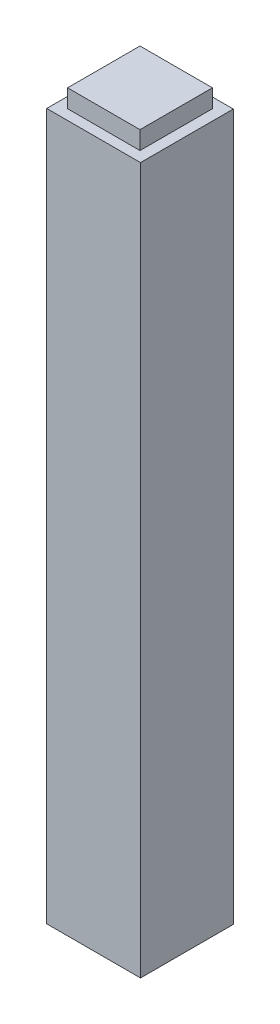
ISO-10303-21;
HEADER;
FILE_DESCRIPTION(('STEP AP214'),'2;1');
FILE_NAME('part.step','',(''),(''),'','','');
FILE_SCHEMA(('AUTOMOTIVE_DESIGN { 1 0 10303 214 1 1 1 1 }'));
ENDSEC;
DATA;
#1=APPLICATION_CONTEXT('core data for automotive mechanical design processes');
#2=APPLICATION_PROTOCOL_DEFINITION('international standard','automotive_design',2000,#1);
#3=PRODUCT_CONTEXT('',#1,'mechanical');
#4=PRODUCT('Part','Part','',(#3));
#5=PRODUCT_RELATED_PRODUCT_CATEGORY('part','',(#4));
#6=PRODUCT_DEFINITION_FORMATION('','',#4);
#7=PRODUCT_DEFINITION_CONTEXT('part definition',#1,'design');
#8=PRODUCT_DEFINITION('design','',#6,#7);
#9=PRODUCT_DEFINITION_SHAPE('','',#8);
#10=(LENGTH_UNIT() NAMED_UNIT(*) SI_UNIT(.MILLI.,.METRE.));
#11=(NAMED_UNIT(*) PLANE_ANGLE_UNIT() SI_UNIT($,.RADIAN.));
#12=(NAMED_UNIT(*) SI_UNIT($,.STERADIAN.) SOLID_ANGLE_UNIT());
#13=UNCERTAINTY_MEASURE_WITH_UNIT(LENGTH_MEASURE(1.E-05),#10,'distance_accuracy_value','');
#14=(GEOMETRIC_REPRESENTATION_CONTEXT(3) GLOBAL_UNCERTAINTY_ASSIGNED_CONTEXT((#13)) GLOBAL_UNIT_ASSIGNED_CONTEXT((#10,
#11,#12)) REPRESENTATION_CONTEXT('',''));
#15=CARTESIAN_POINT('',(0.,0.,0.));
#16=DIRECTION('',(0.,0.,1.));
#17=DIRECTION('',(1.,0.,0.));
#18=AXIS2_PLACEMENT_3D('',#15,#16,#17);
#19=CARTESIAN_POINT('',(-25.8990840738988,390.,25.6196070532155));
#20=DIRECTION('',(-1.,0.,0.));
#21=DIRECTION('',(0.,0.,1.));
#22=AXIS2_PLACEMENT_3D('',#19,#20,#21);
#23=PLANE('',#22);
#24=DIRECTION('',(0.,0.,-1.));
#25=VECTOR('',#24,1.);
#26=CARTESIAN_POINT('',(-25.8990840738988,0.,25.6196070532155));
#27=LINE('',#26,#25);
#28=CARTESIAN_POINT('',(-25.8990840738988,0.,25.6196070532155));
#29=VERTEX_POINT('',#28);
#30=CARTESIAN_POINT('',(-25.8990840738988,0.,-25.6196070532155));
#31=VERTEX_POINT('',#30);
#32=EDGE_CURVE('E117',#29,#31,#27,.T.);
#33=ORIENTED_EDGE('',*,*,#32,.F.);
#34=DIRECTION('',(0.,-1.,0.));
#35=VECTOR('',#34,1.);
#36=CARTESIAN_POINT('',(-25.8990840738988,390.,25.6196070532155));
#37=LINE('',#36,#35);
#38=CARTESIAN_POINT('',(-25.8990840738988,390.,25.6196070532155));
#39=VERTEX_POINT('',#38);
#40=EDGE_CURVE('E12',#39,#29,#37,.T.);
#41=ORIENTED_EDGE('',*,*,#40,.F.);
#42=DIRECTION('',(0.,0.,-1.));
#43=VECTOR('',#42,1.);
#44=CARTESIAN_POINT('',(-25.8990840738988,390.,25.6196070532155));
#45=LINE('',#44,#43);
#46=CARTESIAN_POINT('',(-25.8990840738988,390.,-25.6196070532155));
#47=VERTEX_POINT('',#46);
#48=EDGE_CURVE('E111',#39,#47,#45,.T.);
#49=ORIENTED_EDGE('',*,*,#48,.T.);
#50=DIRECTION('',(0.,-1.,0.));
#51=VECTOR('',#50,1.);
#52=CARTESIAN_POINT('',(-25.8990840738988,390.,-25.6196070532155));
#53=LINE('',#52,#51);
#54=EDGE_CURVE('E56',#47,#31,#53,.T.);
#55=ORIENTED_EDGE('',*,*,#54,.T.);
#56=EDGE_LOOP('',(#33,#41,#49,#55));
#57=FACE_BOUND('',#56,.T.);
#58=ADVANCED_FACE('F53',(#57),#23,.T.);
#59=CARTESIAN_POINT('',(25.8990840738988,390.,25.6196070532155));
#60=DIRECTION('',(0.,0.,1.));
#61=DIRECTION('',(1.,0.,0.));
#62=AXIS2_PLACEMENT_3D('',#59,#60,#61);
#63=PLANE('',#62);
#64=DIRECTION('',(-1.,0.,0.));
#65=VECTOR('',#64,1.);
#66=CARTESIAN_POINT('',(25.8990840738988,0.,25.6196070532155));
#67=LINE('',#66,#65);
#68=CARTESIAN_POINT('',(25.8990840738988,0.,25.6196070532155));
#69=VERTEX_POINT('',#68);
#70=EDGE_CURVE('E113',#69,#29,#67,.T.);
#71=ORIENTED_EDGE('',*,*,#70,.F.);
#72=DIRECTION('',(0.,-1.,0.));
#73=VECTOR('',#72,1.);
#74=CARTESIAN_POINT('',(25.8990840738988,390.,25.6196070532155));
#75=LINE('',#74,#73);
#76=CARTESIAN_POINT('',(25.8990840738988,390.,25.6196070532155));
#77=VERTEX_POINT('',#76);
#78=EDGE_CURVE('E62',#77,#69,#75,.T.);
#79=ORIENTED_EDGE('',*,*,#78,.F.);
#80=DIRECTION('',(-1.,0.,0.));
#81=VECTOR('',#80,1.);
#82=CARTESIAN_POINT('',(25.8990840738988,390.,25.6196070532155));
#83=LINE('',#82,#81);
#84=EDGE_CURVE('E108',#77,#39,#83,.T.);
#85=ORIENTED_EDGE('',*,*,#84,.T.);
#86=ORIENTED_EDGE('',*,*,#40,.T.);
#87=EDGE_LOOP('',(#71,#79,#85,#86));
#88=FACE_BOUND('',#87,.T.);
#89=ADVANCED_FACE('F127',(#88),#63,.T.);
#90=CARTESIAN_POINT('',(25.8990840738988,390.,25.6196070532155));
#91=DIRECTION('',(1.,0.,0.));
#92=DIRECTION('',(0.,0.,-1.));
#93=AXIS2_PLACEMENT_3D('',#90,#91,#92);
#94=PLANE('',#93);
#95=DIRECTION('',(0.,0.,1.));
#96=VECTOR('',#95,1.);
#97=CARTESIAN_POINT('',(25.8990840738988,0.,25.6196070532155));
#98=LINE('',#97,#96);
#99=CARTESIAN_POINT('',(25.8990840738988,0.,-25.6196070532155));
#100=VERTEX_POINT('',#99);
#101=EDGE_CURVE('E103',#100,#69,#98,.T.);
#102=ORIENTED_EDGE('',*,*,#101,.F.);
#103=DIRECTION('',(0.,-1.,0.));
#104=VECTOR('',#103,1.);
#105=CARTESIAN_POINT('',(25.8990840738988,390.,-25.6196070532155));
#106=LINE('',#105,#104);
#107=CARTESIAN_POINT('',(25.8990840738988,390.,-25.6196070532155));
#108=VERTEX_POINT('',#107);
#109=EDGE_CURVE('E98',#108,#100,#106,.T.);
#110=ORIENTED_EDGE('',*,*,#109,.F.);
#111=DIRECTION('',(0.,0.,1.));
#112=VECTOR('',#111,1.);
#113=CARTESIAN_POINT('',(25.8990840738988,390.,25.6196070532155));
#114=LINE('',#113,#112);
#115=EDGE_CURVE('E101',#108,#77,#114,.T.);
#116=ORIENTED_EDGE('',*,*,#115,.T.);
#117=ORIENTED_EDGE('',*,*,#78,.T.);
#118=EDGE_LOOP('',(#102,#110,#116,#117));
#119=FACE_BOUND('',#118,.T.);
#120=ADVANCED_FACE('F100',(#119),#94,.T.);
#121=CARTESIAN_POINT('',(25.8990840738988,390.,-25.6196070532155));
#122=DIRECTION('',(0.,0.,-1.));
#123=DIRECTION('',(-1.,0.,0.));
#124=AXIS2_PLACEMENT_3D('',#121,#122,#123);
#125=PLANE('',#124);
#126=DIRECTION('',(1.,0.,0.));
#127=VECTOR('',#126,1.);
#128=CARTESIAN_POINT('',(25.8990840738988,0.,-25.6196070532155));
#129=LINE('',#128,#127);
#130=EDGE_CURVE('E120',#31,#100,#129,.T.);
#131=ORIENTED_EDGE('',*,*,#130,.F.);
#132=ORIENTED_EDGE('',*,*,#54,.F.);
#133=DIRECTION('',(1.,0.,0.));
#134=VECTOR('',#133,1.);
#135=CARTESIAN_POINT('',(25.8990840738988,390.,-25.6196070532155));
#136=LINE('',#135,#134);
#137=EDGE_CURVE('E107',#47,#108,#136,.T.);
#138=ORIENTED_EDGE('',*,*,#137,.T.);
#139=ORIENTED_EDGE('',*,*,#109,.T.);
#140=EDGE_LOOP('',(#131,#132,#138,#139));
#141=FACE_BOUND('',#140,.T.);
#142=ADVANCED_FACE('F110',(#141),#125,.T.);
#143=CARTESIAN_POINT('',(0.,390.,0.));
#144=DIRECTION('',(0.,1.,0.));
#145=DIRECTION('',(0.,0.,1.));
#146=AXIS2_PLACEMENT_3D('',#143,#144,#145);
#147=PLANE('',#146);
#148=ORIENTED_EDGE('',*,*,#48,.F.);
#149=ORIENTED_EDGE('',*,*,#84,.F.);
#150=ORIENTED_EDGE('',*,*,#115,.F.);
#151=ORIENTED_EDGE('',*,*,#137,.F.);
#152=EDGE_LOOP('',(#148,#149,#150,#151));
#153=FACE_BOUND('',#152,.T.);
#154=ADVANCED_FACE('F106',(#153),#147,.T.);
#155=CARTESIAN_POINT('',(0.,0.,0.));
#156=DIRECTION('',(0.,1.,0.));
#157=DIRECTION('',(0.,0.,1.));
#158=AXIS2_PLACEMENT_3D('',#155,#156,#157);
#159=PLANE('',#158);
#160=ORIENTED_EDGE('',*,*,#32,.T.);
#161=ORIENTED_EDGE('',*,*,#130,.T.);
#162=ORIENTED_EDGE('',*,*,#101,.T.);
#163=ORIENTED_EDGE('',*,*,#70,.T.);
#164=EDGE_LOOP('',(#160,#161,#162,#163));
#165=FACE_BOUND('',#164,.T.);
#166=ADVANCED_FACE('F126',(#165),#159,.F.);
#167=CLOSED_SHELL('',(#58,#89,#120,#142,#154,#166));
#168=MANIFOLD_SOLID_BREP('B2',#167);
#169=CARTESIAN_POINT('',(20.,400.,20.));
#170=DIRECTION('',(-1.,0.,0.));
#171=DIRECTION('',(0.,0.,1.));
#172=AXIS2_PLACEMENT_3D('',#169,#170,#171);
#173=PLANE('',#172);
#174=DIRECTION('',(0.,0.,-1.));
#175=VECTOR('',#174,1.);
#176=CARTESIAN_POINT('',(20.,0.,20.));
#177=LINE('',#176,#175);
#178=CARTESIAN_POINT('',(20.,0.,20.));
#179=VERTEX_POINT('',#178);
#180=CARTESIAN_POINT('',(20.,0.,-20.));
#181=VERTEX_POINT('',#180);
#182=EDGE_CURVE('E240',#179,#181,#177,.T.);
#183=ORIENTED_EDGE('',*,*,#182,.T.);
#184=DIRECTION('',(0.,-1.,0.));
#185=VECTOR('',#184,1.);
#186=CARTESIAN_POINT('',(20.,400.,-20.));
#187=LINE('',#186,#185);
#188=CARTESIAN_POINT('',(20.,400.,-20.));
#189=VERTEX_POINT('',#188);
#190=EDGE_CURVE('E51',#189,#181,#187,.T.);
#191=ORIENTED_EDGE('',*,*,#190,.F.);
#192=DIRECTION('',(0.,0.,-1.));
#193=VECTOR('',#192,1.);
#194=CARTESIAN_POINT('',(20.,400.,20.));
#195=LINE('',#194,#193);
#196=CARTESIAN_POINT('',(20.,400.,20.));
#197=VERTEX_POINT('',#196);
#198=EDGE_CURVE('E228',#197,#189,#195,.T.);
#199=ORIENTED_EDGE('',*,*,#198,.F.);
#200=DIRECTION('',(0.,-1.,0.));
#201=VECTOR('',#200,1.);
#202=CARTESIAN_POINT('',(20.,400.,20.));
#203=LINE('',#202,#201);
#204=EDGE_CURVE('E236',#197,#179,#203,.T.);
#205=ORIENTED_EDGE('',*,*,#204,.T.);
#206=EDGE_LOOP('',(#183,#191,#199,#205));
#207=FACE_BOUND('',#206,.T.);
#208=ADVANCED_FACE('F177',(#207),#173,.F.);
#209=CARTESIAN_POINT('',(-20.,400.,-20.));
#210=DIRECTION('',(0.,0.,1.));
#211=DIRECTION('',(1.,0.,0.));
#212=AXIS2_PLACEMENT_3D('',#209,#210,#211);
#213=PLANE('',#212);
#214=DIRECTION('',(-1.,0.,0.));
#215=VECTOR('',#214,1.);
#216=CARTESIAN_POINT('',(-20.,0.,-20.));
#217=LINE('',#216,#215);
#218=CARTESIAN_POINT('',(-20.,0.,-20.));
#219=VERTEX_POINT('',#218);
#220=EDGE_CURVE('E232',#181,#219,#217,.T.);
#221=ORIENTED_EDGE('',*,*,#220,.T.);
#222=DIRECTION('',(0.,-1.,0.));
#223=VECTOR('',#222,1.);
#224=CARTESIAN_POINT('',(-20.,400.,-20.));
#225=LINE('',#224,#223);
#226=CARTESIAN_POINT('',(-20.,400.,-20.));
#227=VERTEX_POINT('',#226);
#228=EDGE_CURVE('E185',#227,#219,#225,.T.);
#229=ORIENTED_EDGE('',*,*,#228,.F.);
#230=DIRECTION('',(-1.,0.,0.));
#231=VECTOR('',#230,1.);
#232=CARTESIAN_POINT('',(-20.,400.,-20.));
#233=LINE('',#232,#231);
#234=EDGE_CURVE('E223',#189,#227,#233,.T.);
#235=ORIENTED_EDGE('',*,*,#234,.F.);
#236=ORIENTED_EDGE('',*,*,#190,.T.);
#237=EDGE_LOOP('',(#221,#229,#235,#236));
#238=FACE_BOUND('',#237,.T.);
#239=ADVANCED_FACE('F231',(#238),#213,.F.);
#240=CARTESIAN_POINT('',(-20.,400.,20.));
#241=DIRECTION('',(1.,0.,0.));
#242=DIRECTION('',(0.,0.,-1.));
#243=AXIS2_PLACEMENT_3D('',#240,#241,#242);
#244=PLANE('',#243);
#245=DIRECTION('',(0.,0.,1.));
#246=VECTOR('',#245,1.);
#247=CARTESIAN_POINT('',(-20.,0.,20.));
#248=LINE('',#247,#246);
#249=CARTESIAN_POINT('',(-20.,0.,20.));
#250=VERTEX_POINT('',#249);
#251=EDGE_CURVE('E210',#219,#250,#248,.T.);
#252=ORIENTED_EDGE('',*,*,#251,.T.);
#253=DIRECTION('',(0.,-1.,0.));
#254=VECTOR('',#253,1.);
#255=CARTESIAN_POINT('',(-20.,400.,20.));
#256=LINE('',#255,#254);
#257=CARTESIAN_POINT('',(-20.,400.,20.));
#258=VERTEX_POINT('',#257);
#259=EDGE_CURVE('E233',#258,#250,#256,.T.);
#260=ORIENTED_EDGE('',*,*,#259,.F.);
#261=DIRECTION('',(0.,0.,1.));
#262=VECTOR('',#261,1.);
#263=CARTESIAN_POINT('',(-20.,400.,20.));
#264=LINE('',#263,#262);
#265=EDGE_CURVE('E226',#227,#258,#264,.T.);
#266=ORIENTED_EDGE('',*,*,#265,.F.);
#267=ORIENTED_EDGE('',*,*,#228,.T.);
#268=EDGE_LOOP('',(#252,#260,#266,#267));
#269=FACE_BOUND('',#268,.T.);
#270=ADVANCED_FACE('F234',(#269),#244,.F.);
#271=CARTESIAN_POINT('',(-20.,400.,20.));
#272=DIRECTION('',(0.,0.,-1.));
#273=DIRECTION('',(-1.,0.,0.));
#274=AXIS2_PLACEMENT_3D('',#271,#272,#273);
#275=PLANE('',#274);
#276=DIRECTION('',(1.,0.,0.));
#277=VECTOR('',#276,1.);
#278=CARTESIAN_POINT('',(-20.,0.,20.));
#279=LINE('',#278,#277);
#280=EDGE_CURVE('E216',#250,#179,#279,.T.);
#281=ORIENTED_EDGE('',*,*,#280,.T.);
#282=ORIENTED_EDGE('',*,*,#204,.F.);
#283=DIRECTION('',(1.,0.,0.));
#284=VECTOR('',#283,1.);
#285=CARTESIAN_POINT('',(-20.,400.,20.));
#286=LINE('',#285,#284);
#287=EDGE_CURVE('E193',#258,#197,#286,.T.);
#288=ORIENTED_EDGE('',*,*,#287,.F.);
#289=ORIENTED_EDGE('',*,*,#259,.T.);
#290=EDGE_LOOP('',(#281,#282,#288,#289));
#291=FACE_BOUND('',#290,.T.);
#292=ADVANCED_FACE('F247',(#291),#275,.F.);
#293=CARTESIAN_POINT('',(0.,400.,0.));
#294=DIRECTION('',(0.,-1.,0.));
#295=DIRECTION('',(0.,0.,-1.));
#296=AXIS2_PLACEMENT_3D('',#293,#294,#295);
#297=PLANE('',#296);
#298=ORIENTED_EDGE('',*,*,#198,.T.);
#299=ORIENTED_EDGE('',*,*,#234,.T.);
#300=ORIENTED_EDGE('',*,*,#265,.T.);
#301=ORIENTED_EDGE('',*,*,#287,.T.);
#302=EDGE_LOOP('',(#298,#299,#300,#301));
#303=FACE_BOUND('',#302,.T.);
#304=ADVANCED_FACE('F224',(#303),#297,.F.);
#305=CARTESIAN_POINT('',(0.,0.,0.));
#306=DIRECTION('',(0.,-1.,0.));
#307=DIRECTION('',(0.,0.,-1.));
#308=AXIS2_PLACEMENT_3D('',#305,#306,#307);
#309=PLANE('',#308);
#310=ORIENTED_EDGE('',*,*,#182,.F.);
#311=ORIENTED_EDGE('',*,*,#280,.F.);
#312=ORIENTED_EDGE('',*,*,#251,.F.);
#313=ORIENTED_EDGE('',*,*,#220,.F.);
#314=EDGE_LOOP('',(#310,#311,#312,#313));
#315=FACE_BOUND('',#314,.T.);
#316=ADVANCED_FACE('F250',(#315),#309,.T.);
#317=CLOSED_SHELL('',(#208,#239,#270,#292,#304,#316));
#318=MANIFOLD_SOLID_BREP('B6',#317);
#319=ADVANCED_BREP_SHAPE_REPRESENTATION('',(#18,#168,#318),#14);
#320=SHAPE_DEFINITION_REPRESENTATION(#9,#319);
ENDSEC;
END-ISO-10303-21;
